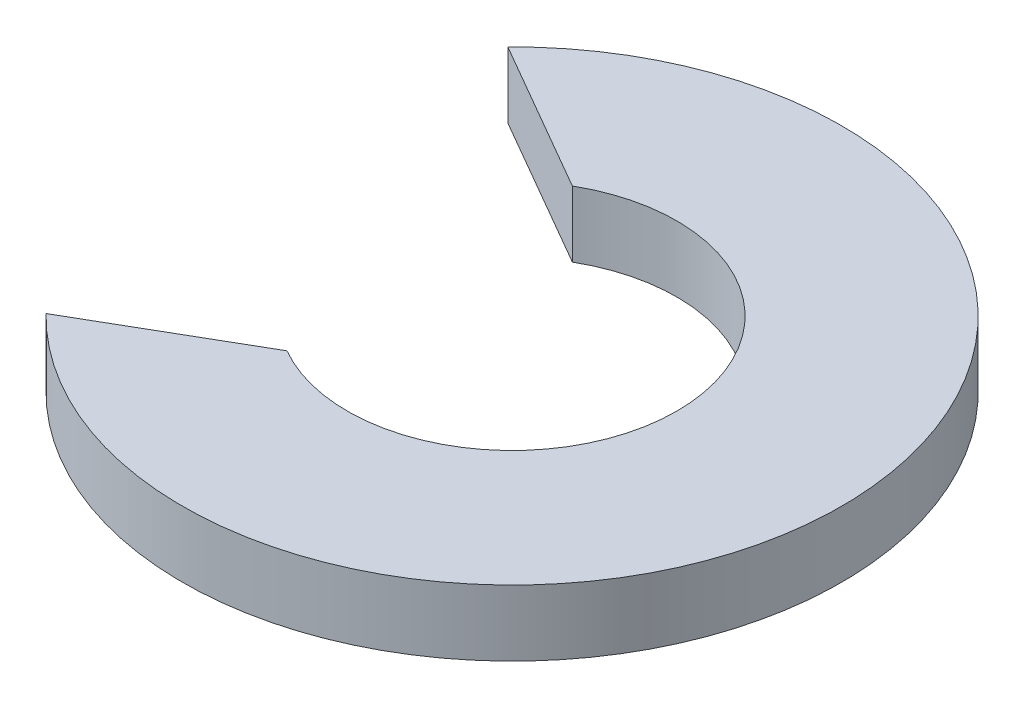
ISO-10303-21;
HEADER;
FILE_DESCRIPTION(('STEP AP214'),'2;1');
FILE_NAME('part.step','',(''),(''),'','','');
FILE_SCHEMA(('AUTOMOTIVE_DESIGN { 1 0 10303 214 1 1 1 1 }'));
ENDSEC;
DATA;
#1=APPLICATION_CONTEXT('core data for automotive mechanical design processes');
#2=APPLICATION_PROTOCOL_DEFINITION('international standard','automotive_design',2000,#1);
#3=PRODUCT_CONTEXT('',#1,'mechanical');
#4=PRODUCT('Part','Part','',(#3));
#5=PRODUCT_RELATED_PRODUCT_CATEGORY('part','',(#4));
#6=PRODUCT_DEFINITION_FORMATION('','',#4);
#7=PRODUCT_DEFINITION_CONTEXT('part definition',#1,'design');
#8=PRODUCT_DEFINITION('design','',#6,#7);
#9=PRODUCT_DEFINITION_SHAPE('','',#8);
#10=(LENGTH_UNIT() NAMED_UNIT(*) SI_UNIT(.MILLI.,.METRE.));
#11=(NAMED_UNIT(*) PLANE_ANGLE_UNIT() SI_UNIT($,.RADIAN.));
#12=(NAMED_UNIT(*) SI_UNIT($,.STERADIAN.) SOLID_ANGLE_UNIT());
#13=UNCERTAINTY_MEASURE_WITH_UNIT(LENGTH_MEASURE(1.E-05),#10,'distance_accuracy_value','');
#14=(GEOMETRIC_REPRESENTATION_CONTEXT(3) GLOBAL_UNCERTAINTY_ASSIGNED_CONTEXT((#13)) GLOBAL_UNIT_ASSIGNED_CONTEXT((#10,
#11,#12)) REPRESENTATION_CONTEXT('',''));
#15=CARTESIAN_POINT('',(0.,0.,0.));
#16=DIRECTION('',(0.,0.,1.));
#17=DIRECTION('',(1.,0.,0.));
#18=AXIS2_PLACEMENT_3D('',#15,#16,#17);
#19=CARTESIAN_POINT('',(0.,0.8,0.));
#20=DIRECTION('',(0.,-1.,0.));
#21=DIRECTION('',(0.,0.,-1.));
#22=AXIS2_PLACEMENT_3D('',#19,#20,#21);
#23=CYLINDRICAL_SURFACE('',#22,2.);
#24=CARTESIAN_POINT('',(0.,0.,0.));
#25=DIRECTION('',(0.,-1.,0.));
#26=DIRECTION('',(0.,0.,1.));
#27=AXIS2_PLACEMENT_3D('',#24,#25,#26);
#28=CIRCLE('',#27,2.);
#29=CARTESIAN_POINT('',(-1.,0.,-1.73205080756888));
#30=VERTEX_POINT('',#29);
#31=CARTESIAN_POINT('',(-1.,0.,1.73205080756888));
#32=VERTEX_POINT('',#31);
#33=EDGE_CURVE('E102',#30,#32,#28,.T.);
#34=ORIENTED_EDGE('',*,*,#33,.T.);
#35=DIRECTION('',(0.,-1.,0.));
#36=VECTOR('',#35,1.);
#37=CARTESIAN_POINT('',(-1.,0.8,1.73205080756888));
#38=LINE('',#37,#36);
#39=CARTESIAN_POINT('',(-1.,0.8,1.73205080756888));
#40=VERTEX_POINT('',#39);
#41=EDGE_CURVE('E11',#40,#32,#38,.T.);
#42=ORIENTED_EDGE('',*,*,#41,.F.);
#43=CARTESIAN_POINT('',(0.,0.8,0.));
#44=DIRECTION('',(0.,-1.,0.));
#45=DIRECTION('',(0.,0.,1.));
#46=AXIS2_PLACEMENT_3D('',#43,#44,#45);
#47=CIRCLE('',#46,2.);
#48=CARTESIAN_POINT('',(-1.,0.8,-1.73205080756888));
#49=VERTEX_POINT('',#48);
#50=EDGE_CURVE('E90',#49,#40,#47,.T.);
#51=ORIENTED_EDGE('',*,*,#50,.F.);
#52=DIRECTION('',(0.,-1.,0.));
#53=VECTOR('',#52,1.);
#54=CARTESIAN_POINT('',(-1.,0.8,-1.73205080756888));
#55=LINE('',#54,#53);
#56=EDGE_CURVE('E98',#49,#30,#55,.T.);
#57=ORIENTED_EDGE('',*,*,#56,.T.);
#58=EDGE_LOOP('',(#34,#42,#51,#57));
#59=FACE_BOUND('',#58,.T.);
#60=ADVANCED_FACE('F39',(#59),#23,.F.);
#61=CARTESIAN_POINT('',(-1.,0.8,1.73205080756888));
#62=DIRECTION('',(0.499999999999995,0.,0.866025403784442));
#63=DIRECTION('',(0.866025403784442,0.,-0.499999999999995));
#64=AXIS2_PLACEMENT_3D('',#61,#62,#63);
#65=PLANE('',#64);
#66=DIRECTION('',(-0.866025403784442,0.,0.499999999999995));
#67=VECTOR('',#66,1.);
#68=CARTESIAN_POINT('',(-1.,0.,1.73205080756888));
#69=LINE('',#68,#67);
#70=CARTESIAN_POINT('',(-2.85410196624969,0.,2.80251707688814));
#71=VERTEX_POINT('',#70);
#72=EDGE_CURVE('E94',#32,#71,#69,.T.);
#73=ORIENTED_EDGE('',*,*,#72,.T.);
#74=DIRECTION('',(0.,-1.,0.));
#75=VECTOR('',#74,1.);
#76=CARTESIAN_POINT('',(-2.85410196624969,0.8,2.80251707688814));
#77=LINE('',#76,#75);
#78=CARTESIAN_POINT('',(-2.85410196624969,0.8,2.80251707688814));
#79=VERTEX_POINT('',#78);
#80=EDGE_CURVE('E47',#79,#71,#77,.T.);
#81=ORIENTED_EDGE('',*,*,#80,.F.);
#82=DIRECTION('',(-0.866025403784442,0.,0.499999999999995));
#83=VECTOR('',#82,1.);
#84=CARTESIAN_POINT('',(-1.,0.8,1.73205080756888));
#85=LINE('',#84,#83);
#86=EDGE_CURVE('E85',#40,#79,#85,.T.);
#87=ORIENTED_EDGE('',*,*,#86,.F.);
#88=ORIENTED_EDGE('',*,*,#41,.T.);
#89=EDGE_LOOP('',(#73,#81,#87,#88));
#90=FACE_BOUND('',#89,.T.);
#91=ADVANCED_FACE('F93',(#90),#65,.F.);
#92=CARTESIAN_POINT('',(0.,0.8,0.));
#93=DIRECTION('',(0.,-1.,0.));
#94=DIRECTION('',(0.,0.,-1.));
#95=AXIS2_PLACEMENT_3D('',#92,#93,#94);
#96=CYLINDRICAL_SURFACE('',#95,4.);
#97=CARTESIAN_POINT('',(0.,0.,0.));
#98=DIRECTION('',(0.,1.,0.));
#99=DIRECTION('',(0.,0.,1.));
#100=AXIS2_PLACEMENT_3D('',#97,#98,#99);
#101=CIRCLE('',#100,4.);
#102=CARTESIAN_POINT('',(-2.85410196624969,0.,-2.80251707688814));
#103=VERTEX_POINT('',#102);
#104=EDGE_CURVE('E72',#71,#103,#101,.T.);
#105=ORIENTED_EDGE('',*,*,#104,.T.);
#106=DIRECTION('',(0.,-1.,0.));
#107=VECTOR('',#106,1.);
#108=CARTESIAN_POINT('',(-2.85410196624969,0.8,-2.80251707688814));
#109=LINE('',#108,#107);
#110=CARTESIAN_POINT('',(-2.85410196624969,0.8,-2.80251707688814));
#111=VERTEX_POINT('',#110);
#112=EDGE_CURVE('E95',#111,#103,#109,.T.);
#113=ORIENTED_EDGE('',*,*,#112,.F.);
#114=CARTESIAN_POINT('',(0.,0.8,0.));
#115=DIRECTION('',(0.,1.,0.));
#116=DIRECTION('',(0.,0.,1.));
#117=AXIS2_PLACEMENT_3D('',#114,#115,#116);
#118=CIRCLE('',#117,4.);
#119=EDGE_CURVE('E88',#79,#111,#118,.T.);
#120=ORIENTED_EDGE('',*,*,#119,.F.);
#121=ORIENTED_EDGE('',*,*,#80,.T.);
#122=EDGE_LOOP('',(#105,#113,#120,#121));
#123=FACE_BOUND('',#122,.T.);
#124=ADVANCED_FACE('F96',(#123),#96,.T.);
#125=CARTESIAN_POINT('',(-1.,0.8,-1.73205080756888));
#126=DIRECTION('',(0.499999999999995,0.,-0.866025403784442));
#127=DIRECTION('',(-0.866025403784442,0.,-0.499999999999995));
#128=AXIS2_PLACEMENT_3D('',#125,#126,#127);
#129=PLANE('',#128);
#130=DIRECTION('',(0.866025403784442,0.,0.499999999999995));
#131=VECTOR('',#130,1.);
#132=CARTESIAN_POINT('',(-1.,0.,-1.73205080756888));
#133=LINE('',#132,#131);
#134=EDGE_CURVE('E78',#103,#30,#133,.T.);
#135=ORIENTED_EDGE('',*,*,#134,.T.);
#136=ORIENTED_EDGE('',*,*,#56,.F.);
#137=DIRECTION('',(0.866025403784442,0.,0.499999999999995));
#138=VECTOR('',#137,1.);
#139=CARTESIAN_POINT('',(-1.,0.8,-1.73205080756888));
#140=LINE('',#139,#138);
#141=EDGE_CURVE('E55',#111,#49,#140,.T.);
#142=ORIENTED_EDGE('',*,*,#141,.F.);
#143=ORIENTED_EDGE('',*,*,#112,.T.);
#144=EDGE_LOOP('',(#135,#136,#142,#143));
#145=FACE_BOUND('',#144,.T.);
#146=ADVANCED_FACE('F109',(#145),#129,.F.);
#147=CARTESIAN_POINT('',(0.,0.8,0.));
#148=DIRECTION('',(0.,1.,0.));
#149=DIRECTION('',(0.,0.,1.));
#150=AXIS2_PLACEMENT_3D('',#147,#148,#149);
#151=PLANE('',#150);
#152=ORIENTED_EDGE('',*,*,#50,.T.);
#153=ORIENTED_EDGE('',*,*,#86,.T.);
#154=ORIENTED_EDGE('',*,*,#119,.T.);
#155=ORIENTED_EDGE('',*,*,#141,.T.);
#156=EDGE_LOOP('',(#152,#153,#154,#155));
#157=FACE_BOUND('',#156,.T.);
#158=ADVANCED_FACE('F86',(#157),#151,.T.);
#159=CARTESIAN_POINT('',(0.,0.,0.));
#160=DIRECTION('',(0.,1.,0.));
#161=DIRECTION('',(0.,0.,1.));
#162=AXIS2_PLACEMENT_3D('',#159,#160,#161);
#163=PLANE('',#162);
#164=ORIENTED_EDGE('',*,*,#33,.F.);
#165=ORIENTED_EDGE('',*,*,#134,.F.);
#166=ORIENTED_EDGE('',*,*,#104,.F.);
#167=ORIENTED_EDGE('',*,*,#72,.F.);
#168=EDGE_LOOP('',(#164,#165,#166,#167));
#169=FACE_BOUND('',#168,.T.);
#170=ADVANCED_FACE('F112',(#169),#163,.F.);
#171=CLOSED_SHELL('',(#60,#91,#124,#146,#158,#170));
#172=MANIFOLD_SOLID_BREP('B2',#171);
#173=ADVANCED_BREP_SHAPE_REPRESENTATION('',(#18,#172),#14);
#174=SHAPE_DEFINITION_REPRESENTATION(#9,#173);
ENDSEC;
END-ISO-10303-21;
